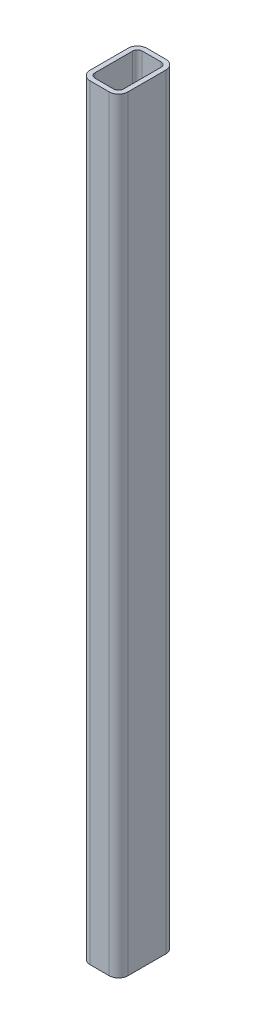
ISO-10303-21;
HEADER;
FILE_DESCRIPTION(('STEP AP214'),'2;1');
FILE_NAME('part.step','',(''),(''),'','','');
FILE_SCHEMA(('AUTOMOTIVE_DESIGN { 1 0 10303 214 1 1 1 1 }'));
ENDSEC;
DATA;
#1=APPLICATION_CONTEXT('core data for automotive mechanical design processes');
#2=APPLICATION_PROTOCOL_DEFINITION('international standard','automotive_design',2000,#1);
#3=PRODUCT_CONTEXT('',#1,'mechanical');
#4=PRODUCT('Part','Part','',(#3));
#5=PRODUCT_RELATED_PRODUCT_CATEGORY('part','',(#4));
#6=PRODUCT_DEFINITION_FORMATION('','',#4);
#7=PRODUCT_DEFINITION_CONTEXT('part definition',#1,'design');
#8=PRODUCT_DEFINITION('design','',#6,#7);
#9=PRODUCT_DEFINITION_SHAPE('','',#8);
#10=(LENGTH_UNIT() NAMED_UNIT(*) SI_UNIT(.MILLI.,.METRE.));
#11=(NAMED_UNIT(*) PLANE_ANGLE_UNIT() SI_UNIT($,.RADIAN.));
#12=(NAMED_UNIT(*) SI_UNIT($,.STERADIAN.) SOLID_ANGLE_UNIT());
#13=UNCERTAINTY_MEASURE_WITH_UNIT(LENGTH_MEASURE(1.E-05),#10,'distance_accuracy_value','');
#14=(GEOMETRIC_REPRESENTATION_CONTEXT(3) GLOBAL_UNCERTAINTY_ASSIGNED_CONTEXT((#13)) GLOBAL_UNIT_ASSIGNED_CONTEXT((#10,
#11,#12)) REPRESENTATION_CONTEXT('',''));
#15=CARTESIAN_POINT('',(0.,0.,0.));
#16=DIRECTION('',(0.,0.,1.));
#17=DIRECTION('',(1.,0.,0.));
#18=AXIS2_PLACEMENT_3D('',#15,#16,#17);
#19=CARTESIAN_POINT('',(-12.699978,1030.,25.4));
#20=DIRECTION('',(0.,-1.,0.));
#21=DIRECTION('',(0.,0.,-1.));
#22=AXIS2_PLACEMENT_3D('',#19,#20,#21);
#23=CYLINDRICAL_SURFACE('',#22,12.7);
#24=CARTESIAN_POINT('',(-12.699978,0.,25.4));
#25=DIRECTION('',(0.,1.,0.));
#26=DIRECTION('',(0.,0.,1.));
#27=AXIS2_PLACEMENT_3D('',#24,#25,#26);
#28=CIRCLE('',#27,12.7);
#29=CARTESIAN_POINT('',(-25.399978,0.,25.4));
#30=VERTEX_POINT('',#29);
#31=CARTESIAN_POINT('',(-12.699978,0.,38.1));
#32=VERTEX_POINT('',#31);
#33=EDGE_CURVE('E235',#30,#32,#28,.T.);
#34=ORIENTED_EDGE('',*,*,#33,.T.);
#35=DIRECTION('',(0.,-1.,0.));
#36=VECTOR('',#35,1.);
#37=CARTESIAN_POINT('',(-12.699978,1030.,38.1));
#38=LINE('',#37,#36);
#39=CARTESIAN_POINT('',(-12.699978,1030.,38.1));
#40=VERTEX_POINT('',#39);
#41=EDGE_CURVE('E12',#40,#32,#38,.T.);
#42=ORIENTED_EDGE('',*,*,#41,.F.);
#43=CARTESIAN_POINT('',(-12.699978,1030.,25.4));
#44=DIRECTION('',(0.,1.,0.));
#45=DIRECTION('',(0.,0.,1.));
#46=AXIS2_PLACEMENT_3D('',#43,#44,#45);
#47=CIRCLE('',#46,12.7);
#48=CARTESIAN_POINT('',(-25.399978,1030.,25.4));
#49=VERTEX_POINT('',#48);
#50=EDGE_CURVE('E313',#49,#40,#47,.T.);
#51=ORIENTED_EDGE('',*,*,#50,.F.);
#52=DIRECTION('',(0.,-1.,0.));
#53=VECTOR('',#52,1.);
#54=CARTESIAN_POINT('',(-25.399978,1030.,25.4));
#55=LINE('',#54,#53);
#56=EDGE_CURVE('E250',#49,#30,#55,.T.);
#57=ORIENTED_EDGE('',*,*,#56,.T.);
#58=EDGE_LOOP('',(#34,#42,#51,#57));
#59=FACE_BOUND('',#58,.T.);
#60=ADVANCED_FACE('F63',(#59),#23,.T.);
#61=CARTESIAN_POINT('',(-12.699978,1030.,38.1));
#62=DIRECTION('',(0.,0.,-1.));
#63=DIRECTION('',(-1.,0.,0.));
#64=AXIS2_PLACEMENT_3D('',#61,#62,#63);
#65=PLANE('',#64);
#66=DIRECTION('',(1.,0.,0.));
#67=VECTOR('',#66,1.);
#68=CARTESIAN_POINT('',(-12.699978,0.,38.1));
#69=LINE('',#68,#67);
#70=CARTESIAN_POINT('',(12.699978,0.,38.1));
#71=VERTEX_POINT('',#70);
#72=EDGE_CURVE('E238',#32,#71,#69,.T.);
#73=ORIENTED_EDGE('',*,*,#72,.T.);
#74=DIRECTION('',(0.,-1.,0.));
#75=VECTOR('',#74,1.);
#76=CARTESIAN_POINT('',(12.699978,1030.,38.1));
#77=LINE('',#76,#75);
#78=CARTESIAN_POINT('',(12.699978,1030.,38.1));
#79=VERTEX_POINT('',#78);
#80=EDGE_CURVE('E73',#79,#71,#77,.T.);
#81=ORIENTED_EDGE('',*,*,#80,.F.);
#82=DIRECTION('',(1.,0.,0.));
#83=VECTOR('',#82,1.);
#84=CARTESIAN_POINT('',(-12.699978,1030.,38.1));
#85=LINE('',#84,#83);
#86=EDGE_CURVE('E315',#40,#79,#85,.T.);
#87=ORIENTED_EDGE('',*,*,#86,.F.);
#88=ORIENTED_EDGE('',*,*,#41,.T.);
#89=EDGE_LOOP('',(#73,#81,#87,#88));
#90=FACE_BOUND('',#89,.T.);
#91=ADVANCED_FACE('F350',(#90),#65,.F.);
#92=CARTESIAN_POINT('',(12.699978,1030.,25.4));
#93=DIRECTION('',(0.,-1.,0.));
#94=DIRECTION('',(0.,0.,-1.));
#95=AXIS2_PLACEMENT_3D('',#92,#93,#94);
#96=CYLINDRICAL_SURFACE('',#95,12.7);
#97=CARTESIAN_POINT('',(12.699978,0.,25.4));
#98=DIRECTION('',(0.,1.,0.));
#99=DIRECTION('',(0.,0.,1.));
#100=AXIS2_PLACEMENT_3D('',#97,#98,#99);
#101=CIRCLE('',#100,12.7);
#102=CARTESIAN_POINT('',(25.399978,0.,25.4));
#103=VERTEX_POINT('',#102);
#104=EDGE_CURVE('E240',#71,#103,#101,.T.);
#105=ORIENTED_EDGE('',*,*,#104,.T.);
#106=DIRECTION('',(0.,-1.,0.));
#107=VECTOR('',#106,1.);
#108=CARTESIAN_POINT('',(25.399978,1030.,25.4));
#109=LINE('',#108,#107);
#110=CARTESIAN_POINT('',(25.399978,1030.,25.4));
#111=VERTEX_POINT('',#110);
#112=EDGE_CURVE('E257',#111,#103,#109,.T.);
#113=ORIENTED_EDGE('',*,*,#112,.F.);
#114=CARTESIAN_POINT('',(12.699978,1030.,25.4));
#115=DIRECTION('',(0.,1.,0.));
#116=DIRECTION('',(0.,0.,1.));
#117=AXIS2_PLACEMENT_3D('',#114,#115,#116);
#118=CIRCLE('',#117,12.7);
#119=EDGE_CURVE('E317',#79,#111,#118,.T.);
#120=ORIENTED_EDGE('',*,*,#119,.F.);
#121=ORIENTED_EDGE('',*,*,#80,.T.);
#122=EDGE_LOOP('',(#105,#113,#120,#121));
#123=FACE_BOUND('',#122,.T.);
#124=ADVANCED_FACE('F355',(#123),#96,.T.);
#125=CARTESIAN_POINT('',(25.399978,1030.,-25.4));
#126=DIRECTION('',(-1.,0.,0.));
#127=DIRECTION('',(0.,0.,1.));
#128=AXIS2_PLACEMENT_3D('',#125,#126,#127);
#129=PLANE('',#128);
#130=DIRECTION('',(0.,0.,-1.));
#131=VECTOR('',#130,1.);
#132=CARTESIAN_POINT('',(25.399978,0.,-25.4));
#133=LINE('',#132,#131);
#134=CARTESIAN_POINT('',(25.399978,0.,-25.4));
#135=VERTEX_POINT('',#134);
#136=EDGE_CURVE('E242',#103,#135,#133,.T.);
#137=ORIENTED_EDGE('',*,*,#136,.T.);
#138=DIRECTION('',(0.,-1.,0.));
#139=VECTOR('',#138,1.);
#140=CARTESIAN_POINT('',(25.399978,1030.,-25.4));
#141=LINE('',#140,#139);
#142=CARTESIAN_POINT('',(25.399978,1030.,-25.4));
#143=VERTEX_POINT('',#142);
#144=EDGE_CURVE('E254',#143,#135,#141,.T.);
#145=ORIENTED_EDGE('',*,*,#144,.F.);
#146=DIRECTION('',(0.,0.,-1.));
#147=VECTOR('',#146,1.);
#148=CARTESIAN_POINT('',(25.399978,1030.,-25.4));
#149=LINE('',#148,#147);
#150=EDGE_CURVE('E319',#111,#143,#149,.T.);
#151=ORIENTED_EDGE('',*,*,#150,.F.);
#152=ORIENTED_EDGE('',*,*,#112,.T.);
#153=EDGE_LOOP('',(#137,#145,#151,#152));
#154=FACE_BOUND('',#153,.T.);
#155=ADVANCED_FACE('F325',(#154),#129,.F.);
#156=CARTESIAN_POINT('',(12.699978,1030.,-25.4));
#157=DIRECTION('',(0.,-1.,0.));
#158=DIRECTION('',(0.,0.,-1.));
#159=AXIS2_PLACEMENT_3D('',#156,#157,#158);
#160=CYLINDRICAL_SURFACE('',#159,12.7);
#161=CARTESIAN_POINT('',(12.699978,0.,-25.4));
#162=DIRECTION('',(0.,1.,0.));
#163=DIRECTION('',(0.,0.,1.));
#164=AXIS2_PLACEMENT_3D('',#161,#162,#163);
#165=CIRCLE('',#164,12.7);
#166=CARTESIAN_POINT('',(12.699978,0.,-38.1));
#167=VERTEX_POINT('',#166);
#168=EDGE_CURVE('E244',#135,#167,#165,.T.);
#169=ORIENTED_EDGE('',*,*,#168,.T.);
#170=DIRECTION('',(0.,-1.,0.));
#171=VECTOR('',#170,1.);
#172=CARTESIAN_POINT('',(12.699978,1030.,-38.1));
#173=LINE('',#172,#171);
#174=CARTESIAN_POINT('',(12.699978,1030.,-38.1));
#175=VERTEX_POINT('',#174);
#176=EDGE_CURVE('E202',#175,#167,#173,.T.);
#177=ORIENTED_EDGE('',*,*,#176,.F.);
#178=CARTESIAN_POINT('',(12.699978,1030.,-25.4));
#179=DIRECTION('',(0.,1.,0.));
#180=DIRECTION('',(0.,0.,1.));
#181=AXIS2_PLACEMENT_3D('',#178,#179,#180);
#182=CIRCLE('',#181,12.7);
#183=EDGE_CURVE('E193',#143,#175,#182,.T.);
#184=ORIENTED_EDGE('',*,*,#183,.F.);
#185=ORIENTED_EDGE('',*,*,#144,.T.);
#186=EDGE_LOOP('',(#169,#177,#184,#185));
#187=FACE_BOUND('',#186,.T.);
#188=ADVANCED_FACE('F329',(#187),#160,.T.);
#189=CARTESIAN_POINT('',(12.699978,1030.,-38.1));
#190=DIRECTION('',(0.,0.,1.));
#191=DIRECTION('',(1.,0.,0.));
#192=AXIS2_PLACEMENT_3D('',#189,#190,#191);
#193=PLANE('',#192);
#194=DIRECTION('',(-1.,0.,0.));
#195=VECTOR('',#194,1.);
#196=CARTESIAN_POINT('',(12.699978,0.,-38.1));
#197=LINE('',#196,#195);
#198=CARTESIAN_POINT('',(-12.699978,0.,-38.1));
#199=VERTEX_POINT('',#198);
#200=EDGE_CURVE('E201',#167,#199,#197,.T.);
#201=ORIENTED_EDGE('',*,*,#200,.T.);
#202=DIRECTION('',(0.,-1.,0.));
#203=VECTOR('',#202,1.);
#204=CARTESIAN_POINT('',(-12.699978,1030.,-38.1));
#205=LINE('',#204,#203);
#206=CARTESIAN_POINT('',(-12.699978,1030.,-38.1));
#207=VERTEX_POINT('',#206);
#208=EDGE_CURVE('E198',#207,#199,#205,.T.);
#209=ORIENTED_EDGE('',*,*,#208,.F.);
#210=DIRECTION('',(-1.,0.,0.));
#211=VECTOR('',#210,1.);
#212=CARTESIAN_POINT('',(12.699978,1030.,-38.1));
#213=LINE('',#212,#211);
#214=EDGE_CURVE('E187',#175,#207,#213,.T.);
#215=ORIENTED_EDGE('',*,*,#214,.F.);
#216=ORIENTED_EDGE('',*,*,#176,.T.);
#217=EDGE_LOOP('',(#201,#209,#215,#216));
#218=FACE_BOUND('',#217,.T.);
#219=ADVANCED_FACE('F199',(#218),#193,.F.);
#220=CARTESIAN_POINT('',(-12.699978,1030.,-25.4));
#221=DIRECTION('',(0.,-1.,0.));
#222=DIRECTION('',(0.,0.,-1.));
#223=AXIS2_PLACEMENT_3D('',#220,#221,#222);
#224=CYLINDRICAL_SURFACE('',#223,12.7);
#225=CARTESIAN_POINT('',(-12.699978,0.,-25.4));
#226=DIRECTION('',(0.,1.,0.));
#227=DIRECTION('',(0.,0.,1.));
#228=AXIS2_PLACEMENT_3D('',#225,#226,#227);
#229=CIRCLE('',#228,12.7);
#230=CARTESIAN_POINT('',(-25.399978,0.,-25.4));
#231=VERTEX_POINT('',#230);
#232=EDGE_CURVE('E135',#199,#231,#229,.T.);
#233=ORIENTED_EDGE('',*,*,#232,.T.);
#234=DIRECTION('',(0.,-1.,0.));
#235=VECTOR('',#234,1.);
#236=CARTESIAN_POINT('',(-25.399978,1030.,-25.4));
#237=LINE('',#236,#235);
#238=CARTESIAN_POINT('',(-25.399978,1030.,-25.4));
#239=VERTEX_POINT('',#238);
#240=EDGE_CURVE('E203',#239,#231,#237,.T.);
#241=ORIENTED_EDGE('',*,*,#240,.F.);
#242=CARTESIAN_POINT('',(-12.699978,1030.,-25.4));
#243=DIRECTION('',(0.,1.,0.));
#244=DIRECTION('',(0.,0.,1.));
#245=AXIS2_PLACEMENT_3D('',#242,#243,#244);
#246=CIRCLE('',#245,12.7);
#247=EDGE_CURVE('E191',#207,#239,#246,.T.);
#248=ORIENTED_EDGE('',*,*,#247,.F.);
#249=ORIENTED_EDGE('',*,*,#208,.T.);
#250=EDGE_LOOP('',(#233,#241,#248,#249));
#251=FACE_BOUND('',#250,.T.);
#252=ADVANCED_FACE('F205',(#251),#224,.T.);
#253=CARTESIAN_POINT('',(12.699978,1030.,25.4));
#254=DIRECTION('',(0.,-1.,0.));
#255=DIRECTION('',(0.,0.,-1.));
#256=AXIS2_PLACEMENT_3D('',#253,#254,#255);
#257=CYLINDRICAL_SURFACE('',#256,6.35);
#258=CARTESIAN_POINT('',(12.699978,0.,25.4));
#259=DIRECTION('',(0.,1.,0.));
#260=DIRECTION('',(0.,0.,1.));
#261=AXIS2_PLACEMENT_3D('',#258,#259,#260);
#262=CIRCLE('',#261,6.35);
#263=CARTESIAN_POINT('',(12.699978,0.,31.75));
#264=VERTEX_POINT('',#263);
#265=CARTESIAN_POINT('',(19.049978,0.,25.4));
#266=VERTEX_POINT('',#265);
#267=EDGE_CURVE('E211',#264,#266,#262,.T.);
#268=ORIENTED_EDGE('',*,*,#267,.F.);
#269=DIRECTION('',(0.,-1.,0.));
#270=VECTOR('',#269,1.);
#271=CARTESIAN_POINT('',(12.699978,1030.,31.75));
#272=LINE('',#271,#270);
#273=CARTESIAN_POINT('',(12.699978,1030.,31.75));
#274=VERTEX_POINT('',#273);
#275=EDGE_CURVE('E67',#274,#264,#272,.T.);
#276=ORIENTED_EDGE('',*,*,#275,.F.);
#277=CARTESIAN_POINT('',(12.699978,1030.,25.4));
#278=DIRECTION('',(0.,1.,0.));
#279=DIRECTION('',(0.,0.,1.));
#280=AXIS2_PLACEMENT_3D('',#277,#278,#279);
#281=CIRCLE('',#280,6.35);
#282=CARTESIAN_POINT('',(19.049978,1030.,25.4));
#283=VERTEX_POINT('',#282);
#284=EDGE_CURVE('E249',#274,#283,#281,.T.);
#285=ORIENTED_EDGE('',*,*,#284,.T.);
#286=DIRECTION('',(0.,-1.,0.));
#287=VECTOR('',#286,1.);
#288=CARTESIAN_POINT('',(19.049978,1030.,25.4));
#289=LINE('',#288,#287);
#290=EDGE_CURVE('E207',#283,#266,#289,.T.);
#291=ORIENTED_EDGE('',*,*,#290,.T.);
#292=EDGE_LOOP('',(#268,#276,#285,#291));
#293=FACE_BOUND('',#292,.T.);
#294=ADVANCED_FACE('F65',(#293),#257,.F.);
#295=CARTESIAN_POINT('',(-12.699978,1030.,31.75));
#296=DIRECTION('',(0.,0.,-1.));
#297=DIRECTION('',(-1.,0.,0.));
#298=AXIS2_PLACEMENT_3D('',#295,#296,#297);
#299=PLANE('',#298);
#300=DIRECTION('',(1.,0.,0.));
#301=VECTOR('',#300,1.);
#302=CARTESIAN_POINT('',(-12.699978,0.,31.75));
#303=LINE('',#302,#301);
#304=CARTESIAN_POINT('',(-12.699978,0.,31.75));
#305=VERTEX_POINT('',#304);
#306=EDGE_CURVE('E214',#305,#264,#303,.T.);
#307=ORIENTED_EDGE('',*,*,#306,.F.);
#308=DIRECTION('',(0.,-1.,0.));
#309=VECTOR('',#308,1.);
#310=CARTESIAN_POINT('',(-12.699978,1030.,31.75));
#311=LINE('',#310,#309);
#312=CARTESIAN_POINT('',(-12.699978,1030.,31.75));
#313=VERTEX_POINT('',#312);
#314=EDGE_CURVE('E272',#313,#305,#311,.T.);
#315=ORIENTED_EDGE('',*,*,#314,.F.);
#316=DIRECTION('',(1.,0.,0.));
#317=VECTOR('',#316,1.);
#318=CARTESIAN_POINT('',(-12.699978,1030.,31.75));
#319=LINE('',#318,#317);
#320=EDGE_CURVE('E281',#313,#274,#319,.T.);
#321=ORIENTED_EDGE('',*,*,#320,.T.);
#322=ORIENTED_EDGE('',*,*,#275,.T.);
#323=EDGE_LOOP('',(#307,#315,#321,#322));
#324=FACE_BOUND('',#323,.T.);
#325=ADVANCED_FACE('F279',(#324),#299,.T.);
#326=CARTESIAN_POINT('',(-12.699978,1030.,25.4));
#327=DIRECTION('',(0.,-1.,0.));
#328=DIRECTION('',(0.,0.,-1.));
#329=AXIS2_PLACEMENT_3D('',#326,#327,#328);
#330=CYLINDRICAL_SURFACE('',#329,6.35);
#331=CARTESIAN_POINT('',(-12.699978,0.,25.4));
#332=DIRECTION('',(0.,1.,0.));
#333=DIRECTION('',(0.,0.,1.));
#334=AXIS2_PLACEMENT_3D('',#331,#332,#333);
#335=CIRCLE('',#334,6.35);
#336=CARTESIAN_POINT('',(-19.049978,0.,25.4));
#337=VERTEX_POINT('',#336);
#338=EDGE_CURVE('E217',#337,#305,#335,.T.);
#339=ORIENTED_EDGE('',*,*,#338,.F.);
#340=DIRECTION('',(0.,-1.,0.));
#341=VECTOR('',#340,1.);
#342=CARTESIAN_POINT('',(-19.049978,1030.,25.4));
#343=LINE('',#342,#341);
#344=CARTESIAN_POINT('',(-19.049978,1030.,25.4));
#345=VERTEX_POINT('',#344);
#346=EDGE_CURVE('E271',#345,#337,#343,.T.);
#347=ORIENTED_EDGE('',*,*,#346,.F.);
#348=CARTESIAN_POINT('',(-12.699978,1030.,25.4));
#349=DIRECTION('',(0.,1.,0.));
#350=DIRECTION('',(0.,0.,1.));
#351=AXIS2_PLACEMENT_3D('',#348,#349,#350);
#352=CIRCLE('',#351,6.35);
#353=EDGE_CURVE('E289',#345,#313,#352,.T.);
#354=ORIENTED_EDGE('',*,*,#353,.T.);
#355=ORIENTED_EDGE('',*,*,#314,.T.);
#356=EDGE_LOOP('',(#339,#347,#354,#355));
#357=FACE_BOUND('',#356,.T.);
#358=ADVANCED_FACE('F287',(#357),#330,.F.);
#359=CARTESIAN_POINT('',(-19.049978,1030.,25.4));
#360=DIRECTION('',(1.,0.,0.));
#361=DIRECTION('',(0.,0.,-1.));
#362=AXIS2_PLACEMENT_3D('',#359,#360,#361);
#363=PLANE('',#362);
#364=DIRECTION('',(0.,0.,1.));
#365=VECTOR('',#364,1.);
#366=CARTESIAN_POINT('',(-19.049978,0.,25.4));
#367=LINE('',#366,#365);
#368=CARTESIAN_POINT('',(-19.049978,0.,-25.4));
#369=VERTEX_POINT('',#368);
#370=EDGE_CURVE('E220',#369,#337,#367,.T.);
#371=ORIENTED_EDGE('',*,*,#370,.F.);
#372=DIRECTION('',(0.,-1.,0.));
#373=VECTOR('',#372,1.);
#374=CARTESIAN_POINT('',(-19.049978,1030.,-25.4));
#375=LINE('',#374,#373);
#376=CARTESIAN_POINT('',(-19.049978,1030.,-25.4));
#377=VERTEX_POINT('',#376);
#378=EDGE_CURVE('E269',#377,#369,#375,.T.);
#379=ORIENTED_EDGE('',*,*,#378,.F.);
#380=DIRECTION('',(0.,0.,1.));
#381=VECTOR('',#380,1.);
#382=CARTESIAN_POINT('',(-19.049978,1030.,25.4));
#383=LINE('',#382,#381);
#384=EDGE_CURVE('E295',#377,#345,#383,.T.);
#385=ORIENTED_EDGE('',*,*,#384,.T.);
#386=ORIENTED_EDGE('',*,*,#346,.T.);
#387=EDGE_LOOP('',(#371,#379,#385,#386));
#388=FACE_BOUND('',#387,.T.);
#389=ADVANCED_FACE('F298',(#388),#363,.T.);
#390=CARTESIAN_POINT('',(-12.699978,1030.,-25.4));
#391=DIRECTION('',(0.,-1.,0.));
#392=DIRECTION('',(0.,0.,-1.));
#393=AXIS2_PLACEMENT_3D('',#390,#391,#392);
#394=CYLINDRICAL_SURFACE('',#393,6.35);
#395=CARTESIAN_POINT('',(-12.699978,0.,-25.4));
#396=DIRECTION('',(0.,1.,0.));
#397=DIRECTION('',(0.,0.,1.));
#398=AXIS2_PLACEMENT_3D('',#395,#396,#397);
#399=CIRCLE('',#398,6.35);
#400=CARTESIAN_POINT('',(-12.699978,0.,-31.75));
#401=VERTEX_POINT('',#400);
#402=EDGE_CURVE('E223',#401,#369,#399,.T.);
#403=ORIENTED_EDGE('',*,*,#402,.F.);
#404=DIRECTION('',(0.,-1.,0.));
#405=VECTOR('',#404,1.);
#406=CARTESIAN_POINT('',(-12.699978,1030.,-31.75));
#407=LINE('',#406,#405);
#408=CARTESIAN_POINT('',(-12.699978,1030.,-31.75));
#409=VERTEX_POINT('',#408);
#410=EDGE_CURVE('E267',#409,#401,#407,.T.);
#411=ORIENTED_EDGE('',*,*,#410,.F.);
#412=CARTESIAN_POINT('',(-12.699978,1030.,-25.4));
#413=DIRECTION('',(0.,1.,0.));
#414=DIRECTION('',(0.,0.,1.));
#415=AXIS2_PLACEMENT_3D('',#412,#413,#414);
#416=CIRCLE('',#415,6.35);
#417=EDGE_CURVE('E299',#409,#377,#416,.T.);
#418=ORIENTED_EDGE('',*,*,#417,.T.);
#419=ORIENTED_EDGE('',*,*,#378,.T.);
#420=EDGE_LOOP('',(#403,#411,#418,#419));
#421=FACE_BOUND('',#420,.T.);
#422=ADVANCED_FACE('F366',(#421),#394,.F.);
#423=CARTESIAN_POINT('',(12.699978,1030.,-31.75));
#424=DIRECTION('',(0.,0.,1.));
#425=DIRECTION('',(1.,0.,0.));
#426=AXIS2_PLACEMENT_3D('',#423,#424,#425);
#427=PLANE('',#426);
#428=DIRECTION('',(-1.,0.,0.));
#429=VECTOR('',#428,1.);
#430=CARTESIAN_POINT('',(12.699978,0.,-31.75));
#431=LINE('',#430,#429);
#432=CARTESIAN_POINT('',(12.699978,0.,-31.75));
#433=VERTEX_POINT('',#432);
#434=EDGE_CURVE('E226',#433,#401,#431,.T.);
#435=ORIENTED_EDGE('',*,*,#434,.F.);
#436=DIRECTION('',(0.,-1.,0.));
#437=VECTOR('',#436,1.);
#438=CARTESIAN_POINT('',(12.699978,1030.,-31.75));
#439=LINE('',#438,#437);
#440=CARTESIAN_POINT('',(12.699978,1030.,-31.75));
#441=VERTEX_POINT('',#440);
#442=EDGE_CURVE('E265',#441,#433,#439,.T.);
#443=ORIENTED_EDGE('',*,*,#442,.F.);
#444=DIRECTION('',(-1.,0.,0.));
#445=VECTOR('',#444,1.);
#446=CARTESIAN_POINT('',(12.699978,1030.,-31.75));
#447=LINE('',#446,#445);
#448=EDGE_CURVE('E301',#441,#409,#447,.T.);
#449=ORIENTED_EDGE('',*,*,#448,.T.);
#450=ORIENTED_EDGE('',*,*,#410,.T.);
#451=EDGE_LOOP('',(#435,#443,#449,#450));
#452=FACE_BOUND('',#451,.T.);
#453=ADVANCED_FACE('F362',(#452),#427,.T.);
#454=CARTESIAN_POINT('',(12.699978,1030.,-25.4));
#455=DIRECTION('',(0.,-1.,0.));
#456=DIRECTION('',(0.,0.,-1.));
#457=AXIS2_PLACEMENT_3D('',#454,#455,#456);
#458=CYLINDRICAL_SURFACE('',#457,6.35);
#459=CARTESIAN_POINT('',(12.699978,0.,-25.4));
#460=DIRECTION('',(0.,1.,0.));
#461=DIRECTION('',(0.,0.,1.));
#462=AXIS2_PLACEMENT_3D('',#459,#460,#461);
#463=CIRCLE('',#462,6.35);
#464=CARTESIAN_POINT('',(19.049978,0.,-25.4));
#465=VERTEX_POINT('',#464);
#466=EDGE_CURVE('E229',#465,#433,#463,.T.);
#467=ORIENTED_EDGE('',*,*,#466,.F.);
#468=DIRECTION('',(0.,-1.,0.));
#469=VECTOR('',#468,1.);
#470=CARTESIAN_POINT('',(19.049978,1030.,-25.4));
#471=LINE('',#470,#469);
#472=CARTESIAN_POINT('',(19.049978,1030.,-25.4));
#473=VERTEX_POINT('',#472);
#474=EDGE_CURVE('E263',#473,#465,#471,.T.);
#475=ORIENTED_EDGE('',*,*,#474,.F.);
#476=CARTESIAN_POINT('',(12.699978,1030.,-25.4));
#477=DIRECTION('',(0.,1.,0.));
#478=DIRECTION('',(0.,0.,1.));
#479=AXIS2_PLACEMENT_3D('',#476,#477,#478);
#480=CIRCLE('',#479,6.35);
#481=EDGE_CURVE('E307',#473,#441,#480,.T.);
#482=ORIENTED_EDGE('',*,*,#481,.T.);
#483=ORIENTED_EDGE('',*,*,#442,.T.);
#484=EDGE_LOOP('',(#467,#475,#482,#483));
#485=FACE_BOUND('',#484,.T.);
#486=ADVANCED_FACE('F344',(#485),#458,.F.);
#487=CARTESIAN_POINT('',(19.049978,1030.,-25.4));
#488=DIRECTION('',(-1.,0.,0.));
#489=DIRECTION('',(0.,0.,1.));
#490=AXIS2_PLACEMENT_3D('',#487,#488,#489);
#491=PLANE('',#490);
#492=DIRECTION('',(0.,0.,-1.));
#493=VECTOR('',#492,1.);
#494=CARTESIAN_POINT('',(19.049978,0.,-25.4));
#495=LINE('',#494,#493);
#496=EDGE_CURVE('E232',#266,#465,#495,.T.);
#497=ORIENTED_EDGE('',*,*,#496,.F.);
#498=ORIENTED_EDGE('',*,*,#290,.F.);
#499=DIRECTION('',(0.,0.,-1.));
#500=VECTOR('',#499,1.);
#501=CARTESIAN_POINT('',(19.049978,1030.,-25.4));
#502=LINE('',#501,#500);
#503=EDGE_CURVE('E310',#283,#473,#502,.T.);
#504=ORIENTED_EDGE('',*,*,#503,.T.);
#505=ORIENTED_EDGE('',*,*,#474,.T.);
#506=EDGE_LOOP('',(#497,#498,#504,#505));
#507=FACE_BOUND('',#506,.T.);
#508=ADVANCED_FACE('F337',(#507),#491,.T.);
#509=CARTESIAN_POINT('',(-25.399978,1030.,25.4));
#510=DIRECTION('',(1.,0.,0.));
#511=DIRECTION('',(0.,0.,-1.));
#512=AXIS2_PLACEMENT_3D('',#509,#510,#511);
#513=PLANE('',#512);
#514=DIRECTION('',(0.,0.,1.));
#515=VECTOR('',#514,1.);
#516=CARTESIAN_POINT('',(-25.399978,0.,25.4));
#517=LINE('',#516,#515);
#518=EDGE_CURVE('E141',#231,#30,#517,.T.);
#519=ORIENTED_EDGE('',*,*,#518,.T.);
#520=ORIENTED_EDGE('',*,*,#56,.F.);
#521=DIRECTION('',(0.,0.,1.));
#522=VECTOR('',#521,1.);
#523=CARTESIAN_POINT('',(-25.399978,1030.,25.4));
#524=LINE('',#523,#522);
#525=EDGE_CURVE('E82',#239,#49,#524,.T.);
#526=ORIENTED_EDGE('',*,*,#525,.F.);
#527=ORIENTED_EDGE('',*,*,#240,.T.);
#528=EDGE_LOOP('',(#519,#520,#526,#527));
#529=FACE_BOUND('',#528,.T.);
#530=ADVANCED_FACE('F335',(#529),#513,.F.);
#531=CARTESIAN_POINT('',(-12.699978,1030.,25.4));
#532=DIRECTION('',(0.,1.,0.));
#533=DIRECTION('',(0.,0.,1.));
#534=AXIS2_PLACEMENT_3D('',#531,#532,#533);
#535=PLANE('',#534);
#536=ORIENTED_EDGE('',*,*,#284,.F.);
#537=ORIENTED_EDGE('',*,*,#320,.F.);
#538=ORIENTED_EDGE('',*,*,#353,.F.);
#539=ORIENTED_EDGE('',*,*,#384,.F.);
#540=ORIENTED_EDGE('',*,*,#417,.F.);
#541=ORIENTED_EDGE('',*,*,#448,.F.);
#542=ORIENTED_EDGE('',*,*,#481,.F.);
#543=ORIENTED_EDGE('',*,*,#503,.F.);
#544=EDGE_LOOP('',(#536,#537,#538,#539,#540,#541,#542,#543));
#545=FACE_BOUND('',#544,.T.);
#546=ORIENTED_EDGE('',*,*,#50,.T.);
#547=ORIENTED_EDGE('',*,*,#86,.T.);
#548=ORIENTED_EDGE('',*,*,#119,.T.);
#549=ORIENTED_EDGE('',*,*,#150,.T.);
#550=ORIENTED_EDGE('',*,*,#183,.T.);
#551=ORIENTED_EDGE('',*,*,#214,.T.);
#552=ORIENTED_EDGE('',*,*,#247,.T.);
#553=ORIENTED_EDGE('',*,*,#525,.T.);
#554=EDGE_LOOP('',(#546,#547,#548,#549,#550,#551,#552,#553));
#555=FACE_BOUND('',#554,.T.);
#556=ADVANCED_FACE('F189',(#545,#555),#535,.T.);
#557=CARTESIAN_POINT('',(-12.699978,0.,25.4));
#558=DIRECTION('',(0.,1.,0.));
#559=DIRECTION('',(0.,0.,1.));
#560=AXIS2_PLACEMENT_3D('',#557,#558,#559);
#561=PLANE('',#560);
#562=ORIENTED_EDGE('',*,*,#267,.T.);
#563=ORIENTED_EDGE('',*,*,#496,.T.);
#564=ORIENTED_EDGE('',*,*,#466,.T.);
#565=ORIENTED_EDGE('',*,*,#434,.T.);
#566=ORIENTED_EDGE('',*,*,#402,.T.);
#567=ORIENTED_EDGE('',*,*,#370,.T.);
#568=ORIENTED_EDGE('',*,*,#338,.T.);
#569=ORIENTED_EDGE('',*,*,#306,.T.);
#570=EDGE_LOOP('',(#562,#563,#564,#565,#566,#567,#568,#569));
#571=FACE_BOUND('',#570,.T.);
#572=ORIENTED_EDGE('',*,*,#33,.F.);
#573=ORIENTED_EDGE('',*,*,#518,.F.);
#574=ORIENTED_EDGE('',*,*,#232,.F.);
#575=ORIENTED_EDGE('',*,*,#200,.F.);
#576=ORIENTED_EDGE('',*,*,#168,.F.);
#577=ORIENTED_EDGE('',*,*,#136,.F.);
#578=ORIENTED_EDGE('',*,*,#104,.F.);
#579=ORIENTED_EDGE('',*,*,#72,.F.);
#580=EDGE_LOOP('',(#572,#573,#574,#575,#576,#577,#578,#579));
#581=FACE_BOUND('',#580,.T.);
#582=ADVANCED_FACE('F284',(#571,#581),#561,.F.);
#583=CLOSED_SHELL('',(#60,#91,#124,#155,#188,#219,#252,#294,#325,#358,#389,#422,#453,#486,#508,
#530,#556,#582));
#584=MANIFOLD_SOLID_BREP('B2',#583);
#585=ADVANCED_BREP_SHAPE_REPRESENTATION('',(#18,#584),#14);
#586=SHAPE_DEFINITION_REPRESENTATION(#9,#585);
ENDSEC;
END-ISO-10303-21;
